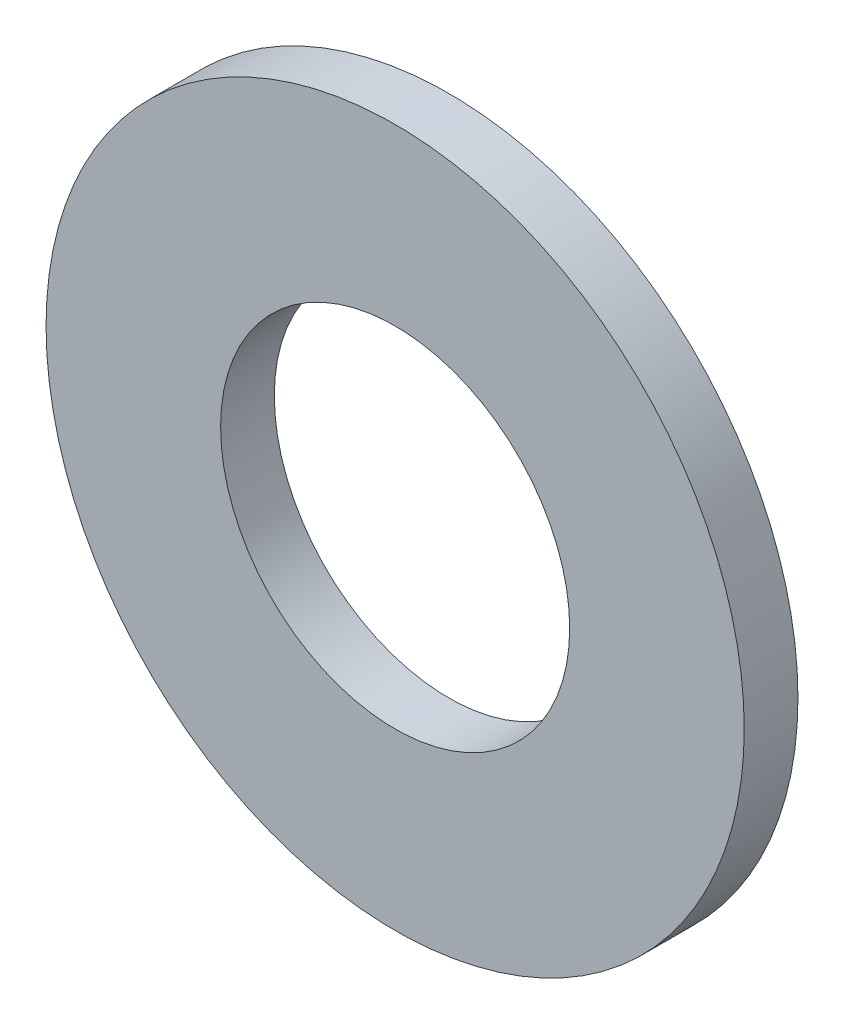
ISO-10303-21;
HEADER;
FILE_DESCRIPTION(('STEP AP214'),'2;1');
FILE_NAME('part.step','',(''),(''),'','','');
FILE_SCHEMA(('AUTOMOTIVE_DESIGN { 1 0 10303 214 1 1 1 1 }'));
ENDSEC;
DATA;
#1=APPLICATION_CONTEXT('core data for automotive mechanical design processes');
#2=APPLICATION_PROTOCOL_DEFINITION('international standard','automotive_design',2000,#1);
#3=PRODUCT_CONTEXT('',#1,'mechanical');
#4=PRODUCT('Part','Part','',(#3));
#5=PRODUCT_RELATED_PRODUCT_CATEGORY('part','',(#4));
#6=PRODUCT_DEFINITION_FORMATION('','',#4);
#7=PRODUCT_DEFINITION_CONTEXT('part definition',#1,'design');
#8=PRODUCT_DEFINITION('design','',#6,#7);
#9=PRODUCT_DEFINITION_SHAPE('','',#8);
#10=(LENGTH_UNIT() NAMED_UNIT(*) SI_UNIT(.MILLI.,.METRE.));
#11=(NAMED_UNIT(*) PLANE_ANGLE_UNIT() SI_UNIT($,.RADIAN.));
#12=(NAMED_UNIT(*) SI_UNIT($,.STERADIAN.) SOLID_ANGLE_UNIT());
#13=UNCERTAINTY_MEASURE_WITH_UNIT(LENGTH_MEASURE(1.E-05),#10,'distance_accuracy_value','');
#14=(GEOMETRIC_REPRESENTATION_CONTEXT(3) GLOBAL_UNCERTAINTY_ASSIGNED_CONTEXT((#13)) GLOBAL_UNIT_ASSIGNED_CONTEXT((#10,
#11,#12)) REPRESENTATION_CONTEXT('',''));
#15=CARTESIAN_POINT('',(0.,0.,0.));
#16=DIRECTION('',(0.,0.,1.));
#17=DIRECTION('',(1.,0.,0.));
#18=AXIS2_PLACEMENT_3D('',#15,#16,#17);
#19=CARTESIAN_POINT('',(0.,0.,1.));
#20=DIRECTION('',(0.,0.,1.));
#21=DIRECTION('',(1.,0.,0.));
#22=AXIS2_PLACEMENT_3D('',#19,#20,#21);
#23=PLANE('',#22);
#24=CARTESIAN_POINT('',(0.,0.,1.));
#25=DIRECTION('',(0.,0.,1.));
#26=DIRECTION('',(1.,0.,0.));
#27=AXIS2_PLACEMENT_3D('',#24,#25,#26);
#28=CIRCLE('',#27,6.5);
#29=CARTESIAN_POINT('',(6.5,0.,1.));
#30=VERTEX_POINT('',#29);
#31=EDGE_CURVE('E10',#30,#30,#28,.T.);
#32=ORIENTED_EDGE('',*,*,#31,.T.);
#33=EDGE_LOOP('',(#32));
#34=FACE_BOUND('',#33,.T.);
#35=CARTESIAN_POINT('',(0.,0.,1.));
#36=DIRECTION('',(0.,0.,1.));
#37=DIRECTION('',(1.,0.,0.));
#38=AXIS2_PLACEMENT_3D('',#35,#36,#37);
#39=CIRCLE('',#38,3.25);
#40=CARTESIAN_POINT('',(3.25,0.,1.));
#41=VERTEX_POINT('',#40);
#42=EDGE_CURVE('E44',#41,#41,#39,.T.);
#43=ORIENTED_EDGE('',*,*,#42,.F.);
#44=EDGE_LOOP('',(#43));
#45=FACE_BOUND('',#44,.T.);
#46=ADVANCED_FACE('F33',(#34,#45),#23,.T.);
#47=CARTESIAN_POINT('',(0.,0.,0.));
#48=DIRECTION('',(0.,0.,1.));
#49=DIRECTION('',(1.,0.,0.));
#50=AXIS2_PLACEMENT_3D('',#47,#48,#49);
#51=PLANE('',#50);
#52=CARTESIAN_POINT('',(0.,0.,0.));
#53=DIRECTION('',(0.,0.,1.));
#54=DIRECTION('',(1.,0.,0.));
#55=AXIS2_PLACEMENT_3D('',#52,#53,#54);
#56=CIRCLE('',#55,6.5);
#57=CARTESIAN_POINT('',(6.5,0.,0.));
#58=VERTEX_POINT('',#57);
#59=EDGE_CURVE('E37',#58,#58,#56,.T.);
#60=ORIENTED_EDGE('',*,*,#59,.F.);
#61=EDGE_LOOP('',(#60));
#62=FACE_BOUND('',#61,.T.);
#63=CARTESIAN_POINT('',(0.,0.,0.));
#64=DIRECTION('',(0.,0.,1.));
#65=DIRECTION('',(1.,0.,0.));
#66=AXIS2_PLACEMENT_3D('',#63,#64,#65);
#67=CIRCLE('',#66,3.25);
#68=CARTESIAN_POINT('',(3.25,0.,0.));
#69=VERTEX_POINT('',#68);
#70=EDGE_CURVE('E46',#69,#69,#67,.T.);
#71=ORIENTED_EDGE('',*,*,#70,.T.);
#72=EDGE_LOOP('',(#71));
#73=FACE_BOUND('',#72,.T.);
#74=ADVANCED_FACE('F56',(#62,#73),#51,.F.);
#75=CARTESIAN_POINT('',(0.,0.,1.));
#76=DIRECTION('',(0.,0.,-1.));
#77=DIRECTION('',(-1.,0.,0.));
#78=AXIS2_PLACEMENT_3D('',#75,#76,#77);
#79=CYLINDRICAL_SURFACE('',#78,6.5);
#80=ORIENTED_EDGE('',*,*,#31,.F.);
#81=EDGE_LOOP('',(#80));
#82=FACE_BOUND('',#81,.T.);
#83=ORIENTED_EDGE('',*,*,#59,.T.);
#84=EDGE_LOOP('',(#83));
#85=FACE_BOUND('',#84,.T.);
#86=ADVANCED_FACE('F35',(#82,#85),#79,.T.);
#87=CARTESIAN_POINT('',(0.,0.,1.));
#88=DIRECTION('',(0.,0.,-1.));
#89=DIRECTION('',(-1.,0.,0.));
#90=AXIS2_PLACEMENT_3D('',#87,#88,#89);
#91=CYLINDRICAL_SURFACE('',#90,3.25);
#92=ORIENTED_EDGE('',*,*,#42,.T.);
#93=EDGE_LOOP('',(#92));
#94=FACE_BOUND('',#93,.T.);
#95=ORIENTED_EDGE('',*,*,#70,.F.);
#96=EDGE_LOOP('',(#95));
#97=FACE_BOUND('',#96,.T.);
#98=ADVANCED_FACE('F52',(#94,#97),#91,.F.);
#99=CLOSED_SHELL('',(#46,#74,#86,#98));
#100=MANIFOLD_SOLID_BREP('B2',#99);
#101=ADVANCED_BREP_SHAPE_REPRESENTATION('',(#18,#100),#14);
#102=SHAPE_DEFINITION_REPRESENTATION(#9,#101);
ENDSEC;
END-ISO-10303-21;
